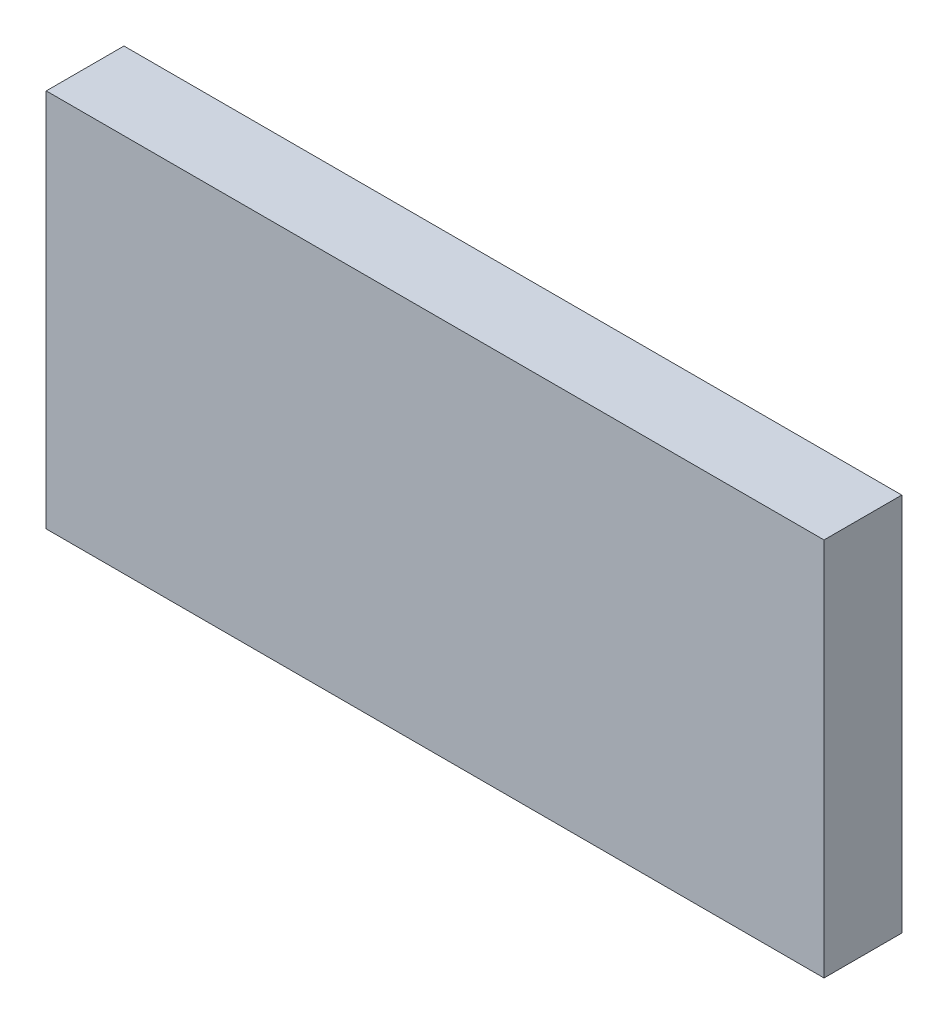
ISO-10303-21;
HEADER;
FILE_DESCRIPTION(('STEP AP214'),'2;1');
FILE_NAME('part.step','',(''),(''),'','','');
FILE_SCHEMA(('AUTOMOTIVE_DESIGN { 1 0 10303 214 1 1 1 1 }'));
ENDSEC;
DATA;
#1=APPLICATION_CONTEXT('core data for automotive mechanical design processes');
#2=APPLICATION_PROTOCOL_DEFINITION('international standard','automotive_design',2000,#1);
#3=PRODUCT_CONTEXT('',#1,'mechanical');
#4=PRODUCT('Part','Part','',(#3));
#5=PRODUCT_RELATED_PRODUCT_CATEGORY('part','',(#4));
#6=PRODUCT_DEFINITION_FORMATION('','',#4);
#7=PRODUCT_DEFINITION_CONTEXT('part definition',#1,'design');
#8=PRODUCT_DEFINITION('design','',#6,#7);
#9=PRODUCT_DEFINITION_SHAPE('','',#8);
#10=(LENGTH_UNIT() NAMED_UNIT(*) SI_UNIT(.MILLI.,.METRE.));
#11=(NAMED_UNIT(*) PLANE_ANGLE_UNIT() SI_UNIT($,.RADIAN.));
#12=(NAMED_UNIT(*) SI_UNIT($,.STERADIAN.) SOLID_ANGLE_UNIT());
#13=UNCERTAINTY_MEASURE_WITH_UNIT(LENGTH_MEASURE(1.E-05),#10,'distance_accuracy_value','');
#14=(GEOMETRIC_REPRESENTATION_CONTEXT(3) GLOBAL_UNCERTAINTY_ASSIGNED_CONTEXT((#13)) GLOBAL_UNIT_ASSIGNED_CONTEXT((#10,
#11,#12)) REPRESENTATION_CONTEXT('',''));
#15=CARTESIAN_POINT('',(0.,0.,0.));
#16=DIRECTION('',(0.,0.,1.));
#17=DIRECTION('',(1.,0.,0.));
#18=AXIS2_PLACEMENT_3D('',#15,#16,#17);
#19=CARTESIAN_POINT('',(-5.005,-3.005,1.));
#20=DIRECTION('',(1.,0.,0.));
#21=DIRECTION('',(0.,0.,-1.));
#22=AXIS2_PLACEMENT_3D('',#19,#20,#21);
#23=PLANE('',#22);
#24=DIRECTION('',(0.,-1.,0.));
#25=VECTOR('',#24,1.);
#26=CARTESIAN_POINT('',(-5.005,-3.005,0.));
#27=LINE('',#26,#25);
#28=CARTESIAN_POINT('',(-5.005,1.875,0.));
#29=VERTEX_POINT('',#28);
#30=CARTESIAN_POINT('',(-5.005,-3.005,0.));
#31=VERTEX_POINT('',#30);
#32=EDGE_CURVE('E95',#29,#31,#27,.T.);
#33=ORIENTED_EDGE('',*,*,#32,.T.);
#34=DIRECTION('',(0.,0.,-1.));
#35=VECTOR('',#34,1.);
#36=CARTESIAN_POINT('',(-5.005,-3.005,1.));
#37=LINE('',#36,#35);
#38=CARTESIAN_POINT('',(-5.005,-3.005,1.));
#39=VERTEX_POINT('',#38);
#40=EDGE_CURVE('E11',#39,#31,#37,.T.);
#41=ORIENTED_EDGE('',*,*,#40,.F.);
#42=DIRECTION('',(0.,-1.,0.));
#43=VECTOR('',#42,1.);
#44=CARTESIAN_POINT('',(-5.005,-3.005,1.));
#45=LINE('',#44,#43);
#46=CARTESIAN_POINT('',(-5.005,1.875,1.));
#47=VERTEX_POINT('',#46);
#48=EDGE_CURVE('E83',#47,#39,#45,.T.);
#49=ORIENTED_EDGE('',*,*,#48,.F.);
#50=DIRECTION('',(0.,0.,-1.));
#51=VECTOR('',#50,1.);
#52=CARTESIAN_POINT('',(-5.005,1.875,1.));
#53=LINE('',#52,#51);
#54=EDGE_CURVE('E91',#47,#29,#53,.T.);
#55=ORIENTED_EDGE('',*,*,#54,.T.);
#56=EDGE_LOOP('',(#33,#41,#49,#55));
#57=FACE_BOUND('',#56,.T.);
#58=ADVANCED_FACE('F32',(#57),#23,.F.);
#59=CARTESIAN_POINT('',(5.,-3.005,1.));
#60=DIRECTION('',(0.,1.,0.));
#61=DIRECTION('',(0.,0.,1.));
#62=AXIS2_PLACEMENT_3D('',#59,#60,#61);
#63=PLANE('',#62);
#64=DIRECTION('',(1.,0.,0.));
#65=VECTOR('',#64,1.);
#66=CARTESIAN_POINT('',(5.,-3.005,0.));
#67=LINE('',#66,#65);
#68=CARTESIAN_POINT('',(5.,-3.005,0.));
#69=VERTEX_POINT('',#68);
#70=EDGE_CURVE('E87',#31,#69,#67,.T.);
#71=ORIENTED_EDGE('',*,*,#70,.T.);
#72=DIRECTION('',(0.,0.,-1.));
#73=VECTOR('',#72,1.);
#74=CARTESIAN_POINT('',(5.,-3.005,1.));
#75=LINE('',#74,#73);
#76=CARTESIAN_POINT('',(5.,-3.005,1.));
#77=VERTEX_POINT('',#76);
#78=EDGE_CURVE('E40',#77,#69,#75,.T.);
#79=ORIENTED_EDGE('',*,*,#78,.F.);
#80=DIRECTION('',(1.,0.,0.));
#81=VECTOR('',#80,1.);
#82=CARTESIAN_POINT('',(5.,-3.005,1.));
#83=LINE('',#82,#81);
#84=EDGE_CURVE('E78',#39,#77,#83,.T.);
#85=ORIENTED_EDGE('',*,*,#84,.F.);
#86=ORIENTED_EDGE('',*,*,#40,.T.);
#87=EDGE_LOOP('',(#71,#79,#85,#86));
#88=FACE_BOUND('',#87,.T.);
#89=ADVANCED_FACE('F86',(#88),#63,.F.);
#90=CARTESIAN_POINT('',(5.,1.875,1.));
#91=DIRECTION('',(-1.,0.,0.));
#92=DIRECTION('',(0.,0.,1.));
#93=AXIS2_PLACEMENT_3D('',#90,#91,#92);
#94=PLANE('',#93);
#95=DIRECTION('',(0.,1.,0.));
#96=VECTOR('',#95,1.);
#97=CARTESIAN_POINT('',(5.,1.875,0.));
#98=LINE('',#97,#96);
#99=CARTESIAN_POINT('',(5.,1.875,0.));
#100=VERTEX_POINT('',#99);
#101=EDGE_CURVE('E65',#69,#100,#98,.T.);
#102=ORIENTED_EDGE('',*,*,#101,.T.);
#103=DIRECTION('',(0.,0.,-1.));
#104=VECTOR('',#103,1.);
#105=CARTESIAN_POINT('',(5.,1.875,1.));
#106=LINE('',#105,#104);
#107=CARTESIAN_POINT('',(5.,1.875,1.));
#108=VERTEX_POINT('',#107);
#109=EDGE_CURVE('E88',#108,#100,#106,.T.);
#110=ORIENTED_EDGE('',*,*,#109,.F.);
#111=DIRECTION('',(0.,1.,0.));
#112=VECTOR('',#111,1.);
#113=CARTESIAN_POINT('',(5.,1.875,1.));
#114=LINE('',#113,#112);
#115=EDGE_CURVE('E81',#77,#108,#114,.T.);
#116=ORIENTED_EDGE('',*,*,#115,.F.);
#117=ORIENTED_EDGE('',*,*,#78,.T.);
#118=EDGE_LOOP('',(#102,#110,#116,#117));
#119=FACE_BOUND('',#118,.T.);
#120=ADVANCED_FACE('F89',(#119),#94,.F.);
#121=CARTESIAN_POINT('',(-5.005,1.875,1.));
#122=DIRECTION('',(0.,-1.,0.));
#123=DIRECTION('',(0.,0.,-1.));
#124=AXIS2_PLACEMENT_3D('',#121,#122,#123);
#125=PLANE('',#124);
#126=DIRECTION('',(-1.,0.,0.));
#127=VECTOR('',#126,1.);
#128=CARTESIAN_POINT('',(-5.005,1.875,0.));
#129=LINE('',#128,#127);
#130=EDGE_CURVE('E71',#100,#29,#129,.T.);
#131=ORIENTED_EDGE('',*,*,#130,.T.);
#132=ORIENTED_EDGE('',*,*,#54,.F.);
#133=DIRECTION('',(-1.,0.,0.));
#134=VECTOR('',#133,1.);
#135=CARTESIAN_POINT('',(-5.005,1.875,1.));
#136=LINE('',#135,#134);
#137=EDGE_CURVE('E48',#108,#47,#136,.T.);
#138=ORIENTED_EDGE('',*,*,#137,.F.);
#139=ORIENTED_EDGE('',*,*,#109,.T.);
#140=EDGE_LOOP('',(#131,#132,#138,#139));
#141=FACE_BOUND('',#140,.T.);
#142=ADVANCED_FACE('F102',(#141),#125,.F.);
#143=CARTESIAN_POINT('',(0.,0.,1.));
#144=DIRECTION('',(0.,0.,-1.));
#145=DIRECTION('',(-1.,0.,0.));
#146=AXIS2_PLACEMENT_3D('',#143,#144,#145);
#147=PLANE('',#146);
#148=ORIENTED_EDGE('',*,*,#48,.T.);
#149=ORIENTED_EDGE('',*,*,#84,.T.);
#150=ORIENTED_EDGE('',*,*,#115,.T.);
#151=ORIENTED_EDGE('',*,*,#137,.T.);
#152=EDGE_LOOP('',(#148,#149,#150,#151));
#153=FACE_BOUND('',#152,.T.);
#154=ADVANCED_FACE('F79',(#153),#147,.F.);
#155=CARTESIAN_POINT('',(0.,0.,0.));
#156=DIRECTION('',(0.,0.,-1.));
#157=DIRECTION('',(-1.,0.,0.));
#158=AXIS2_PLACEMENT_3D('',#155,#156,#157);
#159=PLANE('',#158);
#160=ORIENTED_EDGE('',*,*,#32,.F.);
#161=ORIENTED_EDGE('',*,*,#130,.F.);
#162=ORIENTED_EDGE('',*,*,#101,.F.);
#163=ORIENTED_EDGE('',*,*,#70,.F.);
#164=EDGE_LOOP('',(#160,#161,#162,#163));
#165=FACE_BOUND('',#164,.T.);
#166=ADVANCED_FACE('F105',(#165),#159,.T.);
#167=CLOSED_SHELL('',(#58,#89,#120,#142,#154,#166));
#168=MANIFOLD_SOLID_BREP('B2',#167);
#169=ADVANCED_BREP_SHAPE_REPRESENTATION('',(#18,#168),#14);
#170=SHAPE_DEFINITION_REPRESENTATION(#9,#169);
ENDSEC;
END-ISO-10303-21;
